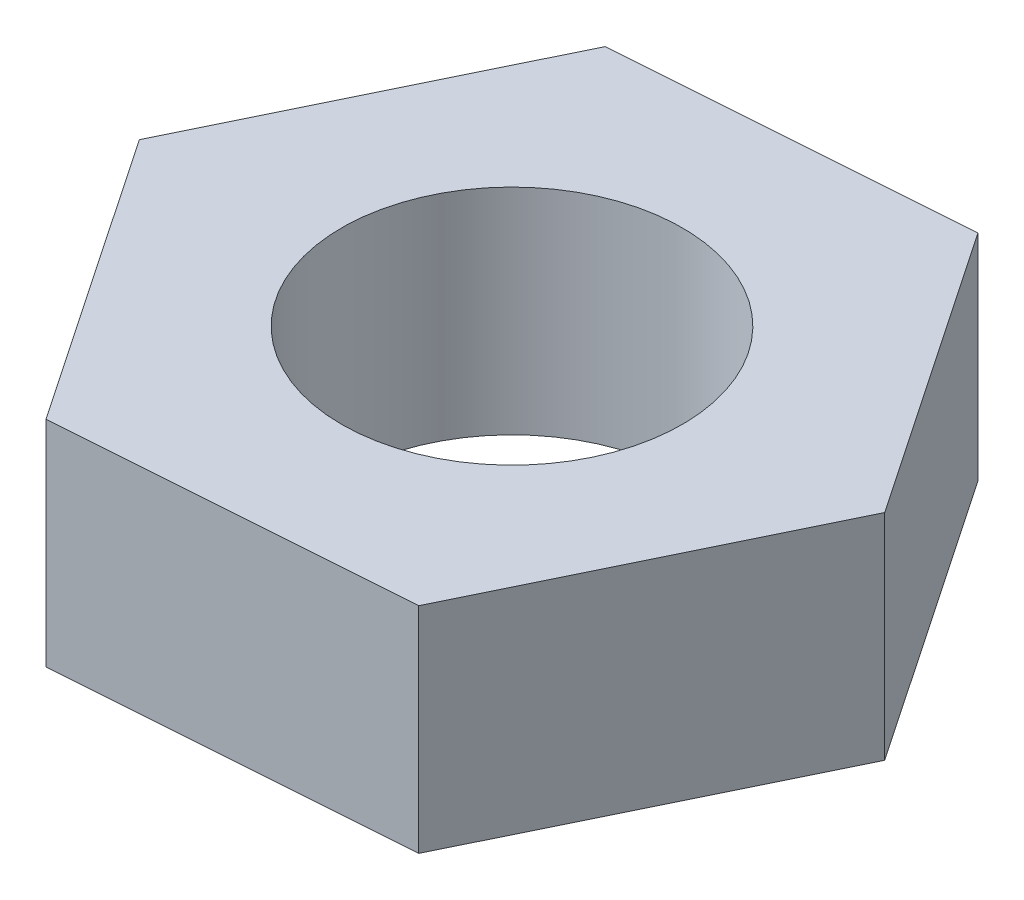
ISO-10303-21;
HEADER;
FILE_DESCRIPTION(('STEP AP214'),'2;1');
FILE_NAME('part.step','',(''),(''),'','','');
FILE_SCHEMA(('AUTOMOTIVE_DESIGN { 1 0 10303 214 1 1 1 1 }'));
ENDSEC;
DATA;
#1=APPLICATION_CONTEXT('core data for automotive mechanical design processes');
#2=APPLICATION_PROTOCOL_DEFINITION('international standard','automotive_design',2000,#1);
#3=PRODUCT_CONTEXT('',#1,'mechanical');
#4=PRODUCT('Part','Part','',(#3));
#5=PRODUCT_RELATED_PRODUCT_CATEGORY('part','',(#4));
#6=PRODUCT_DEFINITION_FORMATION('','',#4);
#7=PRODUCT_DEFINITION_CONTEXT('part definition',#1,'design');
#8=PRODUCT_DEFINITION('design','',#6,#7);
#9=PRODUCT_DEFINITION_SHAPE('','',#8);
#10=(LENGTH_UNIT() NAMED_UNIT(*) SI_UNIT(.MILLI.,.METRE.));
#11=(NAMED_UNIT(*) PLANE_ANGLE_UNIT() SI_UNIT($,.RADIAN.));
#12=(NAMED_UNIT(*) SI_UNIT($,.STERADIAN.) SOLID_ANGLE_UNIT());
#13=UNCERTAINTY_MEASURE_WITH_UNIT(LENGTH_MEASURE(1.E-05),#10,'distance_accuracy_value','');
#14=(GEOMETRIC_REPRESENTATION_CONTEXT(3) GLOBAL_UNCERTAINTY_ASSIGNED_CONTEXT((#13)) GLOBAL_UNIT_ASSIGNED_CONTEXT((#10,
#11,#12)) REPRESENTATION_CONTEXT('',''));
#15=CARTESIAN_POINT('',(0.,0.,0.));
#16=DIRECTION('',(0.,0.,1.));
#17=DIRECTION('',(1.,0.,0.));
#18=AXIS2_PLACEMENT_3D('',#15,#16,#17);
#19=CARTESIAN_POINT('',(0.,8.,0.));
#20=DIRECTION('',(0.,1.,0.));
#21=DIRECTION('',(0.,0.,1.));
#22=AXIS2_PLACEMENT_3D('',#19,#20,#21);
#23=PLANE('',#22);
#24=DIRECTION('',(0.997449631420668,0.,-0.0713738942385383));
#25=VECTOR('',#24,1.);
#26=CARTESIAN_POINT('',(-5.67987173172556,8.,11.6935476700249));
#27=LINE('',#26,#25);
#28=CARTESIAN_POINT('',(-5.67987173172556,8.,11.6935476700249));
#29=VERTEX_POINT('',#28);
#30=CARTESIAN_POINT('',(7.28697347674311,8.,10.7656870449239));
#31=VERTEX_POINT('',#30);
#32=EDGE_CURVE('E128',#29,#31,#27,.T.);
#33=ORIENTED_EDGE('',*,*,#32,.T.);
#34=DIRECTION('',(0.436913210132736,0.,-0.899503666924993));
#35=VECTOR('',#34,1.);
#36=CARTESIAN_POINT('',(7.28697347674311,8.,10.7656870449239));
#37=LINE('',#36,#35);
#38=CARTESIAN_POINT('',(12.9668452084687,8.,-0.927860625100998));
#39=VERTEX_POINT('',#38);
#40=EDGE_CURVE('E86',#31,#39,#37,.T.);
#41=ORIENTED_EDGE('',*,*,#40,.T.);
#42=DIRECTION('',(-0.560536421287932,0.,-0.828129772686454));
#43=VECTOR('',#42,1.);
#44=CARTESIAN_POINT('',(12.9668452084687,8.,-0.927860625100998));
#45=LINE('',#44,#43);
#46=CARTESIAN_POINT('',(5.67987173172557,8.,-11.6935476700249));
#47=VERTEX_POINT('',#46);
#48=EDGE_CURVE('E99',#39,#47,#45,.T.);
#49=ORIENTED_EDGE('',*,*,#48,.T.);
#50=DIRECTION('',(-0.997449631420668,0.,0.0713738942385383));
#51=VECTOR('',#50,1.);
#52=CARTESIAN_POINT('',(5.67987173172557,8.,-11.6935476700249));
#53=LINE('',#52,#51);
#54=CARTESIAN_POINT('',(-7.28697347674312,8.,-10.7656870449239));
#55=VERTEX_POINT('',#54);
#56=EDGE_CURVE('E93',#47,#55,#53,.T.);
#57=ORIENTED_EDGE('',*,*,#56,.T.);
#58=DIRECTION('',(-0.436913210132736,0.,0.899503666924993));
#59=VECTOR('',#58,1.);
#60=CARTESIAN_POINT('',(-7.28697347674312,8.,-10.7656870449239));
#61=LINE('',#60,#59);
#62=CARTESIAN_POINT('',(-12.9668452084687,8.,0.927860625100998));
#63=VERTEX_POINT('',#62);
#64=EDGE_CURVE('E97',#55,#63,#61,.T.);
#65=ORIENTED_EDGE('',*,*,#64,.T.);
#66=DIRECTION('',(0.560536421287932,0.,0.828129772686454));
#67=VECTOR('',#66,1.);
#68=CARTESIAN_POINT('',(-12.9668452084687,8.,0.927860625100998));
#69=LINE('',#68,#67);
#70=EDGE_CURVE('E49',#63,#29,#69,.T.);
#71=ORIENTED_EDGE('',*,*,#70,.T.);
#72=EDGE_LOOP('',(#33,#41,#49,#57,#65,#71));
#73=FACE_BOUND('',#72,.T.);
#74=CARTESIAN_POINT('',(0.,8.,0.));
#75=DIRECTION('',(0.,1.,0.));
#76=DIRECTION('',(0.,0.,1.));
#77=AXIS2_PLACEMENT_3D('',#74,#75,#76);
#78=CIRCLE('',#77,6.35);
#79=CARTESIAN_POINT('',(0.,8.,6.35));
#80=VERTEX_POINT('',#79);
#81=EDGE_CURVE('E121',#80,#80,#78,.T.);
#82=ORIENTED_EDGE('',*,*,#81,.F.);
#83=EDGE_LOOP('',(#82));
#84=FACE_BOUND('',#83,.T.);
#85=ADVANCED_FACE('F32',(#73,#84),#23,.T.);
#86=CARTESIAN_POINT('',(0.,0.,0.));
#87=DIRECTION('',(0.,1.,0.));
#88=DIRECTION('',(0.,0.,1.));
#89=AXIS2_PLACEMENT_3D('',#86,#87,#88);
#90=PLANE('',#89);
#91=DIRECTION('',(0.997449631420668,0.,-0.0713738942385383));
#92=VECTOR('',#91,1.);
#93=CARTESIAN_POINT('',(-5.67987173172556,0.,11.6935476700249));
#94=LINE('',#93,#92);
#95=CARTESIAN_POINT('',(-5.67987173172556,0.,11.6935476700249));
#96=VERTEX_POINT('',#95);
#97=CARTESIAN_POINT('',(7.28697347674311,0.,10.7656870449239));
#98=VERTEX_POINT('',#97);
#99=EDGE_CURVE('E117',#96,#98,#94,.T.);
#100=ORIENTED_EDGE('',*,*,#99,.F.);
#101=DIRECTION('',(0.560536421287932,0.,0.828129772686454));
#102=VECTOR('',#101,1.);
#103=CARTESIAN_POINT('',(-12.9668452084687,0.,0.927860625100998));
#104=LINE('',#103,#102);
#105=CARTESIAN_POINT('',(-12.9668452084687,0.,0.927860625100998));
#106=VERTEX_POINT('',#105);
#107=EDGE_CURVE('E78',#106,#96,#104,.T.);
#108=ORIENTED_EDGE('',*,*,#107,.F.);
#109=DIRECTION('',(-0.436913210132736,0.,0.899503666924993));
#110=VECTOR('',#109,1.);
#111=CARTESIAN_POINT('',(-7.28697347674312,0.,-10.7656870449239));
#112=LINE('',#111,#110);
#113=CARTESIAN_POINT('',(-7.28697347674312,0.,-10.7656870449239));
#114=VERTEX_POINT('',#113);
#115=EDGE_CURVE('E72',#114,#106,#112,.T.);
#116=ORIENTED_EDGE('',*,*,#115,.F.);
#117=DIRECTION('',(-0.997449631420668,0.,0.0713738942385383));
#118=VECTOR('',#117,1.);
#119=CARTESIAN_POINT('',(5.67987173172557,0.,-11.6935476700249));
#120=LINE('',#119,#118);
#121=CARTESIAN_POINT('',(5.67987173172557,0.,-11.6935476700249));
#122=VERTEX_POINT('',#121);
#123=EDGE_CURVE('E107',#122,#114,#120,.T.);
#124=ORIENTED_EDGE('',*,*,#123,.F.);
#125=DIRECTION('',(-0.560536421287932,0.,-0.828129772686454));
#126=VECTOR('',#125,1.);
#127=CARTESIAN_POINT('',(12.9668452084687,0.,-0.927860625100998));
#128=LINE('',#127,#126);
#129=CARTESIAN_POINT('',(12.9668452084687,0.,-0.927860625100998));
#130=VERTEX_POINT('',#129);
#131=EDGE_CURVE('E123',#130,#122,#128,.T.);
#132=ORIENTED_EDGE('',*,*,#131,.F.);
#133=DIRECTION('',(0.436913210132736,0.,-0.899503666924993));
#134=VECTOR('',#133,1.);
#135=CARTESIAN_POINT('',(7.28697347674311,0.,10.7656870449239));
#136=LINE('',#135,#134);
#137=EDGE_CURVE('E120',#98,#130,#136,.T.);
#138=ORIENTED_EDGE('',*,*,#137,.F.);
#139=EDGE_LOOP('',(#100,#108,#116,#124,#132,#138));
#140=FACE_BOUND('',#139,.T.);
#141=CARTESIAN_POINT('',(0.,0.,0.));
#142=DIRECTION('',(0.,1.,0.));
#143=DIRECTION('',(0.,0.,1.));
#144=AXIS2_PLACEMENT_3D('',#141,#142,#143);
#145=CIRCLE('',#144,6.35);
#146=CARTESIAN_POINT('',(0.,0.,6.35));
#147=VERTEX_POINT('',#146);
#148=EDGE_CURVE('E221',#147,#147,#145,.T.);
#149=ORIENTED_EDGE('',*,*,#148,.T.);
#150=EDGE_LOOP('',(#149));
#151=FACE_BOUND('',#150,.T.);
#152=ADVANCED_FACE('F137',(#140,#151),#90,.F.);
#153=CARTESIAN_POINT('',(-5.67987173172556,8.,11.6935476700249));
#154=DIRECTION('',(-0.0713738942385383,0.,-0.997449631420668));
#155=DIRECTION('',(-0.997449631420668,0.,0.0713738942385383));
#156=AXIS2_PLACEMENT_3D('',#153,#154,#155);
#157=PLANE('',#156);
#158=ORIENTED_EDGE('',*,*,#99,.T.);
#159=DIRECTION('',(0.,-1.,0.));
#160=VECTOR('',#159,1.);
#161=CARTESIAN_POINT('',(7.28697347674311,8.,10.7656870449239));
#162=LINE('',#161,#160);
#163=EDGE_CURVE('E11',#31,#98,#162,.T.);
#164=ORIENTED_EDGE('',*,*,#163,.F.);
#165=ORIENTED_EDGE('',*,*,#32,.F.);
#166=DIRECTION('',(0.,-1.,0.));
#167=VECTOR('',#166,1.);
#168=CARTESIAN_POINT('',(-5.67987173172556,8.,11.6935476700249));
#169=LINE('',#168,#167);
#170=EDGE_CURVE('E113',#29,#96,#169,.T.);
#171=ORIENTED_EDGE('',*,*,#170,.T.);
#172=EDGE_LOOP('',(#158,#164,#165,#171));
#173=FACE_BOUND('',#172,.T.);
#174=ADVANCED_FACE('F34',(#173),#157,.F.);
#175=CARTESIAN_POINT('',(7.28697347674311,8.,10.7656870449239));
#176=DIRECTION('',(-0.899503666924993,0.,-0.436913210132736));
#177=DIRECTION('',(-0.436913210132736,0.,0.899503666924993));
#178=AXIS2_PLACEMENT_3D('',#175,#176,#177);
#179=PLANE('',#178);
#180=ORIENTED_EDGE('',*,*,#137,.T.);
#181=DIRECTION('',(0.,-1.,0.));
#182=VECTOR('',#181,1.);
#183=CARTESIAN_POINT('',(12.9668452084687,8.,-0.927860625100998));
#184=LINE('',#183,#182);
#185=EDGE_CURVE('E41',#39,#130,#184,.T.);
#186=ORIENTED_EDGE('',*,*,#185,.F.);
#187=ORIENTED_EDGE('',*,*,#40,.F.);
#188=ORIENTED_EDGE('',*,*,#163,.T.);
#189=EDGE_LOOP('',(#180,#186,#187,#188));
#190=FACE_BOUND('',#189,.T.);
#191=ADVANCED_FACE('F162',(#190),#179,.F.);
#192=CARTESIAN_POINT('',(12.9668452084687,8.,-0.927860625100998));
#193=DIRECTION('',(-0.828129772686454,0.,0.560536421287932));
#194=DIRECTION('',(0.560536421287932,0.,0.828129772686454));
#195=AXIS2_PLACEMENT_3D('',#192,#193,#194);
#196=PLANE('',#195);
#197=ORIENTED_EDGE('',*,*,#131,.T.);
#198=DIRECTION('',(0.,-1.,0.));
#199=VECTOR('',#198,1.);
#200=CARTESIAN_POINT('',(5.67987173172557,8.,-11.6935476700249));
#201=LINE('',#200,#199);
#202=EDGE_CURVE('E108',#47,#122,#201,.T.);
#203=ORIENTED_EDGE('',*,*,#202,.F.);
#204=ORIENTED_EDGE('',*,*,#48,.F.);
#205=ORIENTED_EDGE('',*,*,#185,.T.);
#206=EDGE_LOOP('',(#197,#203,#204,#205));
#207=FACE_BOUND('',#206,.T.);
#208=ADVANCED_FACE('F134',(#207),#196,.F.);
#209=CARTESIAN_POINT('',(5.67987173172557,8.,-11.6935476700249));
#210=DIRECTION('',(0.0713738942385383,0.,0.997449631420668));
#211=DIRECTION('',(0.997449631420668,0.,-0.0713738942385383));
#212=AXIS2_PLACEMENT_3D('',#209,#210,#211);
#213=PLANE('',#212);
#214=ORIENTED_EDGE('',*,*,#123,.T.);
#215=DIRECTION('',(0.,-1.,0.));
#216=VECTOR('',#215,1.);
#217=CARTESIAN_POINT('',(-7.28697347674312,8.,-10.7656870449239));
#218=LINE('',#217,#216);
#219=EDGE_CURVE('E104',#55,#114,#218,.T.);
#220=ORIENTED_EDGE('',*,*,#219,.F.);
#221=ORIENTED_EDGE('',*,*,#56,.F.);
#222=ORIENTED_EDGE('',*,*,#202,.T.);
#223=EDGE_LOOP('',(#214,#220,#221,#222));
#224=FACE_BOUND('',#223,.T.);
#225=ADVANCED_FACE('F105',(#224),#213,.F.);
#226=CARTESIAN_POINT('',(-7.28697347674312,8.,-10.7656870449239));
#227=DIRECTION('',(0.899503666924993,0.,0.436913210132736));
#228=DIRECTION('',(0.436913210132736,0.,-0.899503666924993));
#229=AXIS2_PLACEMENT_3D('',#226,#227,#228);
#230=PLANE('',#229);
#231=ORIENTED_EDGE('',*,*,#115,.T.);
#232=DIRECTION('',(0.,-1.,0.));
#233=VECTOR('',#232,1.);
#234=CARTESIAN_POINT('',(-12.9668452084687,8.,0.927860625100998));
#235=LINE('',#234,#233);
#236=EDGE_CURVE('E109',#63,#106,#235,.T.);
#237=ORIENTED_EDGE('',*,*,#236,.F.);
#238=ORIENTED_EDGE('',*,*,#64,.F.);
#239=ORIENTED_EDGE('',*,*,#219,.T.);
#240=EDGE_LOOP('',(#231,#237,#238,#239));
#241=FACE_BOUND('',#240,.T.);
#242=ADVANCED_FACE('F111',(#241),#230,.F.);
#243=CARTESIAN_POINT('',(-12.9668452084687,8.,0.927860625100998));
#244=DIRECTION('',(0.828129772686454,0.,-0.560536421287932));
#245=DIRECTION('',(-0.560536421287932,0.,-0.828129772686454));
#246=AXIS2_PLACEMENT_3D('',#243,#244,#245);
#247=PLANE('',#246);
#248=ORIENTED_EDGE('',*,*,#107,.T.);
#249=ORIENTED_EDGE('',*,*,#170,.F.);
#250=ORIENTED_EDGE('',*,*,#70,.F.);
#251=ORIENTED_EDGE('',*,*,#236,.T.);
#252=EDGE_LOOP('',(#248,#249,#250,#251));
#253=FACE_BOUND('',#252,.T.);
#254=ADVANCED_FACE('F142',(#253),#247,.F.);
#255=CARTESIAN_POINT('',(0.,8.,0.));
#256=DIRECTION('',(0.,-1.,0.));
#257=DIRECTION('',(0.,0.,-1.));
#258=AXIS2_PLACEMENT_3D('',#255,#256,#257);
#259=CYLINDRICAL_SURFACE('',#258,6.35);
#260=ORIENTED_EDGE('',*,*,#81,.T.);
#261=EDGE_LOOP('',(#260));
#262=FACE_BOUND('',#261,.T.);
#263=ORIENTED_EDGE('',*,*,#148,.F.);
#264=EDGE_LOOP('',(#263));
#265=FACE_BOUND('',#264,.T.);
#266=ADVANCED_FACE('F144',(#262,#265),#259,.F.);
#267=CLOSED_SHELL('',(#85,#152,#174,#191,#208,#225,#242,#254,#266));
#268=MANIFOLD_SOLID_BREP('B2',#267);
#269=ADVANCED_BREP_SHAPE_REPRESENTATION('',(#18,#268),#14);
#270=SHAPE_DEFINITION_REPRESENTATION(#9,#269);
ENDSEC;
END-ISO-10303-21;
